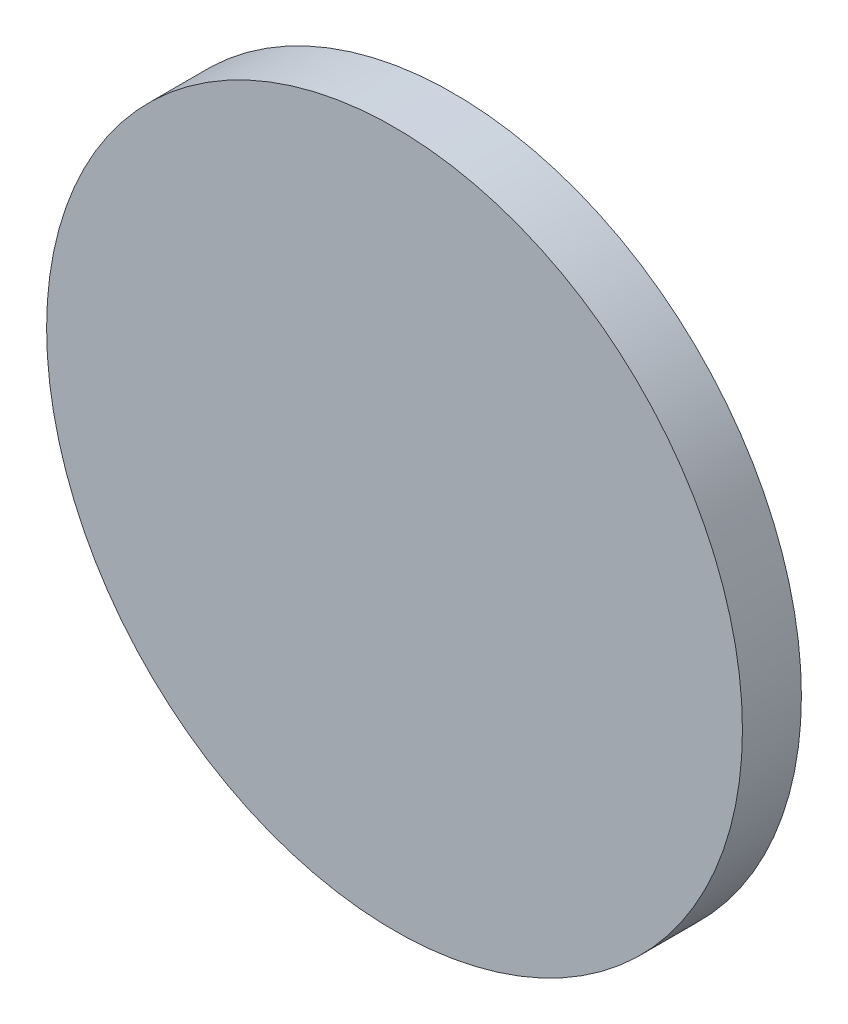
ISO-10303-21;
HEADER;
FILE_DESCRIPTION(('STEP AP214'),'2;1');
FILE_NAME('part.step','',(''),(''),'','','');
FILE_SCHEMA(('AUTOMOTIVE_DESIGN { 1 0 10303 214 1 1 1 1 }'));
ENDSEC;
DATA;
#1=APPLICATION_CONTEXT('core data for automotive mechanical design processes');
#2=APPLICATION_PROTOCOL_DEFINITION('international standard','automotive_design',2000,#1);
#3=PRODUCT_CONTEXT('',#1,'mechanical');
#4=PRODUCT('Part','Part','',(#3));
#5=PRODUCT_RELATED_PRODUCT_CATEGORY('part','',(#4));
#6=PRODUCT_DEFINITION_FORMATION('','',#4);
#7=PRODUCT_DEFINITION_CONTEXT('part definition',#1,'design');
#8=PRODUCT_DEFINITION('design','',#6,#7);
#9=PRODUCT_DEFINITION_SHAPE('','',#8);
#10=(LENGTH_UNIT() NAMED_UNIT(*) SI_UNIT(.MILLI.,.METRE.));
#11=(NAMED_UNIT(*) PLANE_ANGLE_UNIT() SI_UNIT($,.RADIAN.));
#12=(NAMED_UNIT(*) SI_UNIT($,.STERADIAN.) SOLID_ANGLE_UNIT());
#13=UNCERTAINTY_MEASURE_WITH_UNIT(LENGTH_MEASURE(1.E-05),#10,'distance_accuracy_value','');
#14=(GEOMETRIC_REPRESENTATION_CONTEXT(3) GLOBAL_UNCERTAINTY_ASSIGNED_CONTEXT((#13)) GLOBAL_UNIT_ASSIGNED_CONTEXT((#10,
#11,#12)) REPRESENTATION_CONTEXT('',''));
#15=CARTESIAN_POINT('',(0.,0.,0.));
#16=DIRECTION('',(0.,0.,1.));
#17=DIRECTION('',(1.,0.,0.));
#18=AXIS2_PLACEMENT_3D('',#15,#16,#17);
#19=CARTESIAN_POINT('',(0.,0.,0.));
#20=DIRECTION('',(0.,0.,1.));
#21=DIRECTION('',(1.,0.,0.));
#22=AXIS2_PLACEMENT_3D('',#19,#20,#21);
#23=PLANE('',#22);
#24=CARTESIAN_POINT('',(0.,0.,0.));
#25=DIRECTION('',(0.,0.,1.));
#26=DIRECTION('',(1.,0.,0.));
#27=AXIS2_PLACEMENT_3D('',#24,#25,#26);
#28=CIRCLE('',#27,2.95);
#29=CARTESIAN_POINT('',(2.95,0.,0.));
#30=VERTEX_POINT('',#29);
#31=EDGE_CURVE('E18',#30,#30,#28,.T.);
#32=ORIENTED_EDGE('',*,*,#31,.F.);
#33=EDGE_LOOP('',(#32));
#34=FACE_BOUND('',#33,.T.);
#35=ADVANCED_FACE('F15',(#34),#23,.F.);
#36=CARTESIAN_POINT('',(0.,0.,0.));
#37=DIRECTION('',(0.,0.,1.));
#38=DIRECTION('',(1.,0.,0.));
#39=AXIS2_PLACEMENT_3D('',#36,#37,#38);
#40=CYLINDRICAL_SURFACE('',#39,2.95);
#41=CARTESIAN_POINT('',(0.,0.,0.5));
#42=DIRECTION('',(0.,0.,1.));
#43=DIRECTION('',(1.,0.,0.));
#44=AXIS2_PLACEMENT_3D('',#41,#42,#43);
#45=CIRCLE('',#44,2.95);
#46=CARTESIAN_POINT('',(2.95,0.,0.5));
#47=VERTEX_POINT('',#46);
#48=EDGE_CURVE('E10',#47,#47,#45,.T.);
#49=ORIENTED_EDGE('',*,*,#48,.F.);
#50=EDGE_LOOP('',(#49));
#51=FACE_BOUND('',#50,.T.);
#52=ORIENTED_EDGE('',*,*,#31,.T.);
#53=EDGE_LOOP('',(#52));
#54=FACE_BOUND('',#53,.T.);
#55=ADVANCED_FACE('F27',(#51,#54),#40,.T.);
#56=CARTESIAN_POINT('',(0.,0.,0.5));
#57=DIRECTION('',(0.,0.,1.));
#58=DIRECTION('',(1.,0.,0.));
#59=AXIS2_PLACEMENT_3D('',#56,#57,#58);
#60=PLANE('',#59);
#61=ORIENTED_EDGE('',*,*,#48,.T.);
#62=EDGE_LOOP('',(#61));
#63=FACE_BOUND('',#62,.T.);
#64=ADVANCED_FACE('F34',(#63),#60,.T.);
#65=CLOSED_SHELL('',(#35,#55,#64));
#66=MANIFOLD_SOLID_BREP('B1',#65);
#67=ADVANCED_BREP_SHAPE_REPRESENTATION('',(#18,#66),#14);
#68=SHAPE_DEFINITION_REPRESENTATION(#9,#67);
ENDSEC;
END-ISO-10303-21;
